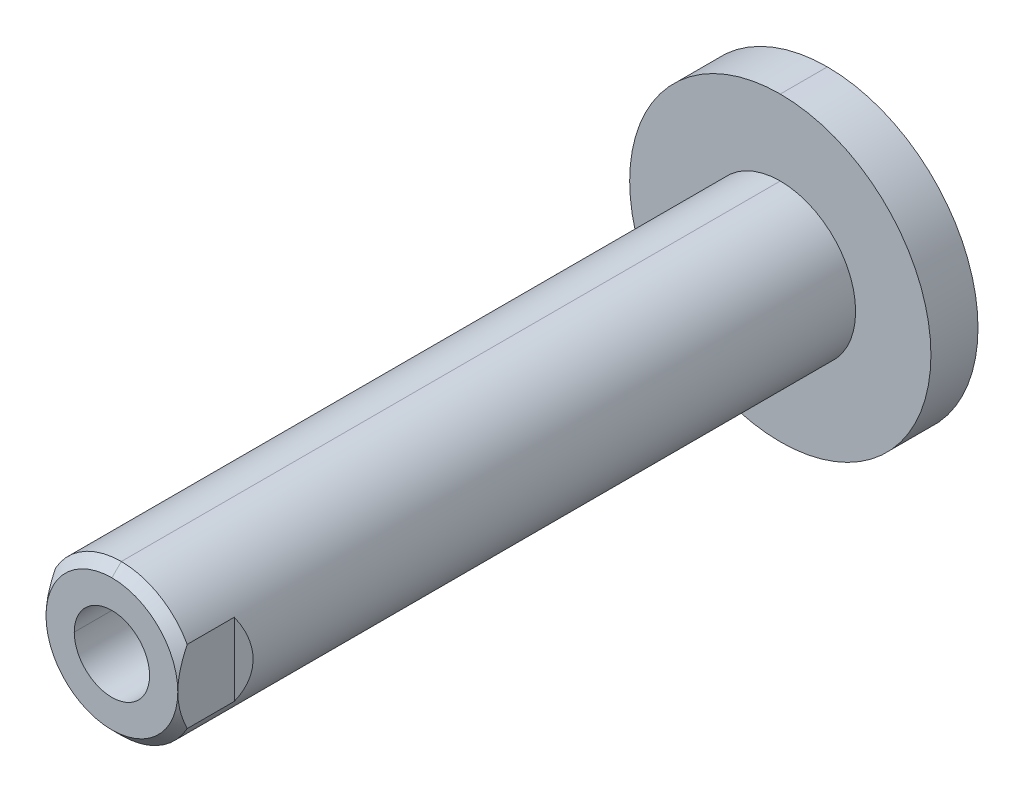
ISO-10303-21;
HEADER;
FILE_DESCRIPTION(('STEP AP214'),'2;1');
FILE_NAME('part.step','',(''),(''),'','','');
FILE_SCHEMA(('AUTOMOTIVE_DESIGN { 1 0 10303 214 1 1 1 1 }'));
ENDSEC;
DATA;
#1=APPLICATION_CONTEXT('core data for automotive mechanical design processes');
#2=APPLICATION_PROTOCOL_DEFINITION('international standard','automotive_design',2000,#1);
#3=PRODUCT_CONTEXT('',#1,'mechanical');
#4=PRODUCT('Part','Part','',(#3));
#5=PRODUCT_RELATED_PRODUCT_CATEGORY('part','',(#4));
#6=PRODUCT_DEFINITION_FORMATION('','',#4);
#7=PRODUCT_DEFINITION_CONTEXT('part definition',#1,'design');
#8=PRODUCT_DEFINITION('design','',#6,#7);
#9=PRODUCT_DEFINITION_SHAPE('','',#8);
#10=(LENGTH_UNIT() NAMED_UNIT(*) SI_UNIT(.MILLI.,.METRE.));
#11=(NAMED_UNIT(*) PLANE_ANGLE_UNIT() SI_UNIT($,.RADIAN.));
#12=(NAMED_UNIT(*) SI_UNIT($,.STERADIAN.) SOLID_ANGLE_UNIT());
#13=UNCERTAINTY_MEASURE_WITH_UNIT(LENGTH_MEASURE(1.E-05),#10,'distance_accuracy_value','');
#14=(GEOMETRIC_REPRESENTATION_CONTEXT(3) GLOBAL_UNCERTAINTY_ASSIGNED_CONTEXT((#13)) GLOBAL_UNIT_ASSIGNED_CONTEXT((#10,
#11,#12)) REPRESENTATION_CONTEXT('',''));
#15=CARTESIAN_POINT('',(0.,0.,0.));
#16=DIRECTION('',(0.,0.,1.));
#17=DIRECTION('',(1.,0.,0.));
#18=AXIS2_PLACEMENT_3D('',#15,#16,#17);
#19=CARTESIAN_POINT('',(0.,0.,48.5));
#20=DIRECTION('',(0.,0.,-1.));
#21=DIRECTION('',(0.,1.,0.));
#22=AXIS2_PLACEMENT_3D('',#19,#20,#21);
#23=CONICAL_SURFACE('',#22,7.,0.785398163397442);
#24=CARTESIAN_POINT('',(0.,0.,48.5));
#25=DIRECTION('',(0.,0.,1.));
#26=DIRECTION('',(0.,1.,0.));
#27=AXIS2_PLACEMENT_3D('',#24,#25,#26);
#28=CIRCLE('',#27,7.);
#29=CARTESIAN_POINT('',(0.,7.,48.5));
#30=VERTEX_POINT('',#29);
#31=CARTESIAN_POINT('',(-7.,0.,48.5));
#32=VERTEX_POINT('',#31);
#33=EDGE_CURVE('E42',#30,#32,#28,.T.);
#34=ORIENTED_EDGE('',*,*,#33,.F.);
#35=DIRECTION('',(0.,0.707106781186543,-0.707106781186552));
#36=VECTOR('',#35,1.);
#37=CARTESIAN_POINT('',(0.,7.,48.5));
#38=LINE('',#37,#36);
#39=CARTESIAN_POINT('',(0.,8.,47.5));
#40=VERTEX_POINT('',#39);
#41=EDGE_CURVE('E11',#30,#40,#38,.T.);
#42=ORIENTED_EDGE('',*,*,#41,.T.);
#43=CARTESIAN_POINT('',(0.,0.,47.5));
#44=DIRECTION('',(0.,0.,-1.));
#45=DIRECTION('',(0.,1.,0.));
#46=AXIS2_PLACEMENT_3D('',#43,#44,#45);
#47=CIRCLE('',#46,8.);
#48=CARTESIAN_POINT('',(-7.,3.87298334620746,47.5));
#49=VERTEX_POINT('',#48);
#50=EDGE_CURVE('E231',#49,#40,#47,.T.);
#51=ORIENTED_EDGE('',*,*,#50,.F.);
#52=CARTESIAN_POINT('',(-7.,0.,48.5));
#53=CARTESIAN_POINT('',(-7.,0.9736613095143,48.5));
#54=CARTESIAN_POINT('',(-7.,1.98627172463951,48.2236495848466));
#55=CARTESIAN_POINT('',(-7.,2.88465323921036,47.9784732556193));
#56=CARTESIAN_POINT('',(-7.,3.87298334620746,47.5));
#57=B_SPLINE_CURVE_WITH_KNOTS('',2,(#52,#53,#54,#55,#56),.UNSPECIFIED.,.F.,.F.,(3,2,3),(0.,0.5,
1.),.UNSPECIFIED.);
#58=EDGE_CURVE('E226',#32,#49,#57,.T.);
#59=ORIENTED_EDGE('',*,*,#58,.F.);
#60=EDGE_LOOP('',(#34,#42,#51,#59));
#61=FACE_BOUND('',#60,.T.);
#62=ADVANCED_FACE('F16',(#61),#23,.T.);
#63=CARTESIAN_POINT('',(0.,0.,48.5));
#64=DIRECTION('',(0.,0.,1.));
#65=DIRECTION('',(1.,0.,0.));
#66=AXIS2_PLACEMENT_3D('',#63,#64,#65);
#67=CYLINDRICAL_SURFACE('',#66,4.);
#68=CARTESIAN_POINT('',(0.,0.,35.5));
#69=DIRECTION('',(0.,0.,1.));
#70=DIRECTION('',(1.,0.,0.));
#71=AXIS2_PLACEMENT_3D('',#68,#69,#70);
#72=CIRCLE('',#71,4.);
#73=CARTESIAN_POINT('',(-4.,0.,35.5));
#74=VERTEX_POINT('',#73);
#75=CARTESIAN_POINT('',(4.,0.,35.5));
#76=VERTEX_POINT('',#75);
#77=EDGE_CURVE('E74',#74,#76,#72,.T.);
#78=ORIENTED_EDGE('',*,*,#77,.F.);
#79=DIRECTION('',(0.,0.,1.));
#80=VECTOR('',#79,1.);
#81=CARTESIAN_POINT('',(-4.,0.,48.5));
#82=LINE('',#81,#80);
#83=CARTESIAN_POINT('',(-4.,0.,48.5));
#84=VERTEX_POINT('',#83);
#85=EDGE_CURVE('E28',#74,#84,#82,.T.);
#86=ORIENTED_EDGE('',*,*,#85,.T.);
#87=CARTESIAN_POINT('',(0.,0.,48.5));
#88=DIRECTION('',(0.,0.,1.));
#89=DIRECTION('',(1.,0.,0.));
#90=AXIS2_PLACEMENT_3D('',#87,#88,#89);
#91=CIRCLE('',#90,4.);
#92=CARTESIAN_POINT('',(4.,0.,48.5));
#93=VERTEX_POINT('',#92);
#94=EDGE_CURVE('E88',#84,#93,#91,.T.);
#95=ORIENTED_EDGE('',*,*,#94,.T.);
#96=DIRECTION('',(0.,0.,1.));
#97=VECTOR('',#96,1.);
#98=CARTESIAN_POINT('',(4.,0.,48.5));
#99=LINE('',#98,#97);
#100=EDGE_CURVE('E178',#76,#93,#99,.T.);
#101=ORIENTED_EDGE('',*,*,#100,.F.);
#102=EDGE_LOOP('',(#78,#86,#95,#101));
#103=FACE_BOUND('',#102,.T.);
#104=ADVANCED_FACE('F241',(#103),#67,.F.);
#105=CARTESIAN_POINT('',(0.,0.,48.5));
#106=DIRECTION('',(0.,0.,1.));
#107=DIRECTION('',(1.,0.,0.));
#108=AXIS2_PLACEMENT_3D('',#105,#106,#107);
#109=CYLINDRICAL_SURFACE('',#108,3.4);
#110=CARTESIAN_POINT('',(0.,0.,31.75));
#111=DIRECTION('',(0.,0.,1.));
#112=DIRECTION('',(1.,0.,0.));
#113=AXIS2_PLACEMENT_3D('',#110,#111,#112);
#114=CIRCLE('',#113,3.4);
#115=CARTESIAN_POINT('',(-3.4,0.,31.75));
#116=VERTEX_POINT('',#115);
#117=CARTESIAN_POINT('',(3.4,0.,31.75));
#118=VERTEX_POINT('',#117);
#119=EDGE_CURVE('E176',#116,#118,#114,.T.);
#120=ORIENTED_EDGE('',*,*,#119,.F.);
#121=DIRECTION('',(0.,0.,1.));
#122=VECTOR('',#121,1.);
#123=CARTESIAN_POINT('',(-3.4,0.,48.5));
#124=LINE('',#123,#122);
#125=CARTESIAN_POINT('',(-3.4,0.,35.5));
#126=VERTEX_POINT('',#125);
#127=EDGE_CURVE('E307',#116,#126,#124,.T.);
#128=ORIENTED_EDGE('',*,*,#127,.T.);
#129=CARTESIAN_POINT('',(0.,0.,35.5));
#130=DIRECTION('',(0.,0.,1.));
#131=DIRECTION('',(1.,0.,0.));
#132=AXIS2_PLACEMENT_3D('',#129,#130,#131);
#133=CIRCLE('',#132,3.4);
#134=CARTESIAN_POINT('',(3.4,0.,35.5));
#135=VERTEX_POINT('',#134);
#136=EDGE_CURVE('E314',#126,#135,#133,.T.);
#137=ORIENTED_EDGE('',*,*,#136,.T.);
#138=DIRECTION('',(0.,0.,1.));
#139=VECTOR('',#138,1.);
#140=CARTESIAN_POINT('',(3.4,0.,48.5));
#141=LINE('',#140,#139);
#142=EDGE_CURVE('E327',#118,#135,#141,.T.);
#143=ORIENTED_EDGE('',*,*,#142,.F.);
#144=EDGE_LOOP('',(#120,#128,#137,#143));
#145=FACE_BOUND('',#144,.T.);
#146=ADVANCED_FACE('F405',(#145),#109,.F.);
#147=CARTESIAN_POINT('',(0.,0.,31.75));
#148=DIRECTION('',(0.,0.,1.));
#149=DIRECTION('',(1.,0.,0.));
#150=AXIS2_PLACEMENT_3D('',#147,#148,#149);
#151=CONICAL_SURFACE('',#150,3.4,1.02974425867665);
#152=DIRECTION('',(0.857167300702111,0.,0.515038074910056));
#153=VECTOR('',#152,1.);
#154=CARTESIAN_POINT('',(3.4,0.,31.75));
#155=LINE('',#154,#153);
#156=CARTESIAN_POINT('',(0.,0.,29.7070738953063));
#157=VERTEX_POINT('',#156);
#158=EDGE_CURVE('E340',#157,#118,#155,.T.);
#159=ORIENTED_EDGE('',*,*,#158,.F.);
#160=DIRECTION('',(-0.857167300702111,0.,0.515038074910056));
#161=VECTOR('',#160,1.);
#162=CARTESIAN_POINT('',(-3.4,0.,31.75));
#163=LINE('',#162,#161);
#164=EDGE_CURVE('E324',#157,#116,#163,.T.);
#165=ORIENTED_EDGE('',*,*,#164,.T.);
#166=ORIENTED_EDGE('',*,*,#119,.T.);
#167=EDGE_LOOP('',(#159,#165,#166));
#168=FACE_BOUND('',#167,.T.);
#169=ADVANCED_FACE('F400',(#168),#151,.F.);
#170=CARTESIAN_POINT('',(0.,0.,-27.5));
#171=DIRECTION('',(0.,0.,1.));
#172=DIRECTION('',(0.,-1.,0.));
#173=AXIS2_PLACEMENT_3D('',#170,#171,#172);
#174=CYLINDRICAL_SURFACE('',#173,16.);
#175=CARTESIAN_POINT('',(0.,0.,-27.5));
#176=DIRECTION('',(0.,0.,1.));
#177=DIRECTION('',(0.,-1.,0.));
#178=AXIS2_PLACEMENT_3D('',#175,#176,#177);
#179=CIRCLE('',#178,16.);
#180=CARTESIAN_POINT('',(0.,-16.,-27.5));
#181=VERTEX_POINT('',#180);
#182=CARTESIAN_POINT('',(0.,16.,-27.5));
#183=VERTEX_POINT('',#182);
#184=EDGE_CURVE('E315',#181,#183,#179,.T.);
#185=ORIENTED_EDGE('',*,*,#184,.T.);
#186=DIRECTION('',(0.,0.,1.));
#187=VECTOR('',#186,1.);
#188=CARTESIAN_POINT('',(0.,16.,-27.5));
#189=LINE('',#188,#187);
#190=CARTESIAN_POINT('',(0.,16.,-22.5));
#191=VERTEX_POINT('',#190);
#192=EDGE_CURVE('E161',#183,#191,#189,.T.);
#193=ORIENTED_EDGE('',*,*,#192,.T.);
#194=CARTESIAN_POINT('',(0.,0.,-22.5));
#195=DIRECTION('',(0.,0.,1.));
#196=DIRECTION('',(0.,-1.,0.));
#197=AXIS2_PLACEMENT_3D('',#194,#195,#196);
#198=CIRCLE('',#197,16.);
#199=CARTESIAN_POINT('',(0.,-16.,-22.5));
#200=VERTEX_POINT('',#199);
#201=EDGE_CURVE('E185',#200,#191,#198,.T.);
#202=ORIENTED_EDGE('',*,*,#201,.F.);
#203=DIRECTION('',(0.,0.,1.));
#204=VECTOR('',#203,1.);
#205=CARTESIAN_POINT('',(0.,-16.,-27.5));
#206=LINE('',#205,#204);
#207=EDGE_CURVE('E356',#181,#200,#206,.T.);
#208=ORIENTED_EDGE('',*,*,#207,.F.);
#209=EDGE_LOOP('',(#185,#193,#202,#208));
#210=FACE_BOUND('',#209,.T.);
#211=ADVANCED_FACE('F500',(#210),#174,.T.);
#212=CARTESIAN_POINT('',(0.,0.,-27.5));
#213=DIRECTION('',(0.,0.,1.));
#214=DIRECTION('',(0.,-1.,0.));
#215=AXIS2_PLACEMENT_3D('',#212,#213,#214);
#216=CYLINDRICAL_SURFACE('',#215,8.);
#217=CARTESIAN_POINT('',(0.,0.,-22.5));
#218=DIRECTION('',(0.,0.,1.));
#219=DIRECTION('',(0.,-1.,0.));
#220=AXIS2_PLACEMENT_3D('',#217,#218,#219);
#221=CIRCLE('',#220,8.);
#222=CARTESIAN_POINT('',(0.,-8.,-22.5));
#223=VERTEX_POINT('',#222);
#224=CARTESIAN_POINT('',(0.,8.,-22.5));
#225=VERTEX_POINT('',#224);
#226=EDGE_CURVE('E146',#223,#225,#221,.T.);
#227=ORIENTED_EDGE('',*,*,#226,.T.);
#228=DIRECTION('',(0.,0.,1.));
#229=VECTOR('',#228,1.);
#230=CARTESIAN_POINT('',(0.,8.,-27.5));
#231=LINE('',#230,#229);
#232=EDGE_CURVE('E162',#225,#40,#231,.T.);
#233=ORIENTED_EDGE('',*,*,#232,.T.);
#234=CARTESIAN_POINT('',(0.,0.,47.5));
#235=DIRECTION('',(0.,0.,-1.));
#236=DIRECTION('',(0.,1.,0.));
#237=AXIS2_PLACEMENT_3D('',#234,#235,#236);
#238=CIRCLE('',#237,8.);
#239=CARTESIAN_POINT('',(7.,3.87298334620746,47.5));
#240=VERTEX_POINT('',#239);
#241=EDGE_CURVE('E292',#40,#240,#238,.T.);
#242=ORIENTED_EDGE('',*,*,#241,.T.);
#243=DIRECTION('',(0.,0.,1.));
#244=VECTOR('',#243,1.);
#245=CARTESIAN_POINT('',(7.,3.87298334620746,42.5));
#246=LINE('',#245,#244);
#247=CARTESIAN_POINT('',(7.,3.87298334620746,42.5));
#248=VERTEX_POINT('',#247);
#249=EDGE_CURVE('E380',#248,#240,#246,.T.);
#250=ORIENTED_EDGE('',*,*,#249,.F.);
#251=CARTESIAN_POINT('',(7.,3.87298334620746,42.5));
#252=CARTESIAN_POINT('',(8.36363636363637,1.40835758043908,41.1363636363636));
#253=CARTESIAN_POINT('',(8.36363636363636,-1.40835758043907,41.1363636363636));
#254=CARTESIAN_POINT('',(7.,-3.87298334620745,42.5));
#255=(BOUNDED_CURVE() B_SPLINE_CURVE(3,(#251,#252,#253,#254),.UNSPECIFIED.,.F.,
.F.) B_SPLINE_CURVE_WITH_KNOTS((4,4),(2.63623214330563,3.64695316387395),
.UNSPECIFIED.) CURVE() GEOMETRIC_REPRESENTATION_ITEM() RATIONAL_B_SPLINE_CURVE((1.,
0.916666666666665,0.916666666666665,1.)) REPRESENTATION_ITEM(''));
#256=CARTESIAN_POINT('',(7.,-3.87298334620745,42.5));
#257=VERTEX_POINT('',#256);
#258=EDGE_CURVE('E284',#248,#257,#255,.T.);
#259=ORIENTED_EDGE('',*,*,#258,.T.);
#260=DIRECTION('',(0.,0.,1.));
#261=VECTOR('',#260,1.);
#262=CARTESIAN_POINT('',(7.,-3.87298334620745,42.5));
#263=LINE('',#262,#261);
#264=CARTESIAN_POINT('',(7.,-3.87298334620745,47.5));
#265=VERTEX_POINT('',#264);
#266=EDGE_CURVE('E280',#257,#265,#263,.T.);
#267=ORIENTED_EDGE('',*,*,#266,.T.);
#268=CARTESIAN_POINT('',(0.,0.,47.5));
#269=DIRECTION('',(0.,0.,-1.));
#270=DIRECTION('',(0.,1.,0.));
#271=AXIS2_PLACEMENT_3D('',#268,#269,#270);
#272=CIRCLE('',#271,8.);
#273=CARTESIAN_POINT('',(0.,-8.,47.5));
#274=VERTEX_POINT('',#273);
#275=EDGE_CURVE('E149',#265,#274,#272,.T.);
#276=ORIENTED_EDGE('',*,*,#275,.T.);
#277=DIRECTION('',(0.,0.,1.));
#278=VECTOR('',#277,1.);
#279=CARTESIAN_POINT('',(0.,-8.,-27.5));
#280=LINE('',#279,#278);
#281=EDGE_CURVE('E142',#223,#274,#280,.T.);
#282=ORIENTED_EDGE('',*,*,#281,.F.);
#283=EDGE_LOOP('',(#227,#233,#242,#250,#259,#267,#276,#282));
#284=FACE_BOUND('',#283,.T.);
#285=ADVANCED_FACE('F144',(#284),#216,.T.);
#286=CARTESIAN_POINT('',(0.,0.,48.5));
#287=DIRECTION('',(0.,0.,-1.));
#288=DIRECTION('',(0.,-1.,0.));
#289=AXIS2_PLACEMENT_3D('',#286,#287,#288);
#290=PLANE('',#289);
#291=CARTESIAN_POINT('',(0.,0.,48.5));
#292=DIRECTION('',(0.,0.,1.));
#293=DIRECTION('',(0.,1.,0.));
#294=AXIS2_PLACEMENT_3D('',#291,#292,#293);
#295=CIRCLE('',#294,7.);
#296=CARTESIAN_POINT('',(7.,0.,48.5));
#297=VERTEX_POINT('',#296);
#298=EDGE_CURVE('E281',#297,#30,#295,.T.);
#299=ORIENTED_EDGE('',*,*,#298,.T.);
#300=ORIENTED_EDGE('',*,*,#33,.T.);
#301=CARTESIAN_POINT('',(0.,0.,48.5));
#302=DIRECTION('',(0.,0.,1.));
#303=DIRECTION('',(0.,1.,0.));
#304=AXIS2_PLACEMENT_3D('',#301,#302,#303);
#305=CIRCLE('',#304,7.);
#306=EDGE_CURVE('E166',#32,#297,#305,.T.);
#307=ORIENTED_EDGE('',*,*,#306,.T.);
#308=EDGE_LOOP('',(#299,#300,#307));
#309=FACE_BOUND('',#308,.T.);
#310=CARTESIAN_POINT('',(0.,0.,48.5));
#311=DIRECTION('',(0.,0.,1.));
#312=DIRECTION('',(1.,0.,0.));
#313=AXIS2_PLACEMENT_3D('',#310,#311,#312);
#314=CIRCLE('',#313,4.);
#315=EDGE_CURVE('E181',#93,#84,#314,.T.);
#316=ORIENTED_EDGE('',*,*,#315,.F.);
#317=ORIENTED_EDGE('',*,*,#94,.F.);
#318=EDGE_LOOP('',(#316,#317));
#319=FACE_BOUND('',#318,.T.);
#320=ADVANCED_FACE('F244',(#309,#319),#290,.F.);
#321=CARTESIAN_POINT('',(0.,0.,-27.5));
#322=DIRECTION('',(0.,0.,1.));
#323=DIRECTION('',(0.,-1.,0.));
#324=AXIS2_PLACEMENT_3D('',#321,#322,#323);
#325=CYLINDRICAL_SURFACE('',#324,8.);
#326=ORIENTED_EDGE('',*,*,#232,.F.);
#327=CARTESIAN_POINT('',(0.,0.,-22.5));
#328=DIRECTION('',(0.,0.,1.));
#329=DIRECTION('',(0.,-1.,0.));
#330=AXIS2_PLACEMENT_3D('',#327,#328,#329);
#331=CIRCLE('',#330,8.);
#332=EDGE_CURVE('E155',#225,#223,#331,.T.);
#333=ORIENTED_EDGE('',*,*,#332,.T.);
#334=ORIENTED_EDGE('',*,*,#281,.T.);
#335=CARTESIAN_POINT('',(0.,0.,47.5));
#336=DIRECTION('',(0.,0.,-1.));
#337=DIRECTION('',(0.,1.,0.));
#338=AXIS2_PLACEMENT_3D('',#335,#336,#337);
#339=CIRCLE('',#338,8.);
#340=CARTESIAN_POINT('',(-7.,-3.87298334620745,47.5));
#341=VERTEX_POINT('',#340);
#342=EDGE_CURVE('E156',#274,#341,#339,.T.);
#343=ORIENTED_EDGE('',*,*,#342,.T.);
#344=DIRECTION('',(0.,0.,1.));
#345=VECTOR('',#344,1.);
#346=CARTESIAN_POINT('',(-7.,-3.87298334620745,42.5));
#347=LINE('',#346,#345);
#348=CARTESIAN_POINT('',(-7.,-3.87298334620745,42.5));
#349=VERTEX_POINT('',#348);
#350=EDGE_CURVE('E758',#349,#341,#347,.T.);
#351=ORIENTED_EDGE('',*,*,#350,.F.);
#352=CARTESIAN_POINT('',(-7.,-3.87298334620745,42.5));
#353=CARTESIAN_POINT('',(-8.36363636363636,-1.40835758043907,41.1363636363636));
#354=CARTESIAN_POINT('',(-8.36363636363636,1.40835758043908,41.1363636363636));
#355=CARTESIAN_POINT('',(-7.,3.87298334620746,42.5));
#356=(BOUNDED_CURVE() B_SPLINE_CURVE(3,(#352,#353,#354,#355),.UNSPECIFIED.,.F.,
.F.) B_SPLINE_CURVE_WITH_KNOTS((4,4),(2.63623214330563,3.64695316387395),
.UNSPECIFIED.) CURVE() GEOMETRIC_REPRESENTATION_ITEM() RATIONAL_B_SPLINE_CURVE((1.,
0.916666666666665,0.916666666666665,1.)) REPRESENTATION_ITEM(''));
#357=CARTESIAN_POINT('',(-7.,3.87298334620746,42.5));
#358=VERTEX_POINT('',#357);
#359=EDGE_CURVE('E366',#349,#358,#356,.T.);
#360=ORIENTED_EDGE('',*,*,#359,.T.);
#361=DIRECTION('',(0.,0.,1.));
#362=VECTOR('',#361,1.);
#363=CARTESIAN_POINT('',(-7.,3.87298334620746,42.5));
#364=LINE('',#363,#362);
#365=EDGE_CURVE('E372',#358,#49,#364,.T.);
#366=ORIENTED_EDGE('',*,*,#365,.T.);
#367=ORIENTED_EDGE('',*,*,#50,.T.);
#368=EDGE_LOOP('',(#326,#333,#334,#343,#351,#360,#366,#367));
#369=FACE_BOUND('',#368,.T.);
#370=ADVANCED_FACE('F164',(#369),#325,.T.);
#371=CARTESIAN_POINT('',(0.,8.,-22.5));
#372=DIRECTION('',(0.,0.,-1.));
#373=DIRECTION('',(0.,-1.,0.));
#374=AXIS2_PLACEMENT_3D('',#371,#372,#373);
#375=PLANE('',#374);
#376=ORIENTED_EDGE('',*,*,#201,.T.);
#377=CARTESIAN_POINT('',(0.,0.,-22.5));
#378=DIRECTION('',(0.,0.,1.));
#379=DIRECTION('',(0.,-1.,0.));
#380=AXIS2_PLACEMENT_3D('',#377,#378,#379);
#381=CIRCLE('',#380,16.);
#382=EDGE_CURVE('E182',#191,#200,#381,.T.);
#383=ORIENTED_EDGE('',*,*,#382,.T.);
#384=EDGE_LOOP('',(#376,#383));
#385=FACE_BOUND('',#384,.T.);
#386=ORIENTED_EDGE('',*,*,#226,.F.);
#387=ORIENTED_EDGE('',*,*,#332,.F.);
#388=EDGE_LOOP('',(#386,#387));
#389=FACE_BOUND('',#388,.T.);
#390=ADVANCED_FACE('F159',(#385,#389),#375,.F.);
#391=CARTESIAN_POINT('',(0.,0.,-27.5));
#392=DIRECTION('',(0.,0.,1.));
#393=DIRECTION('',(0.,-1.,0.));
#394=AXIS2_PLACEMENT_3D('',#391,#392,#393);
#395=CYLINDRICAL_SURFACE('',#394,16.);
#396=ORIENTED_EDGE('',*,*,#192,.F.);
#397=CARTESIAN_POINT('',(0.,0.,-27.5));
#398=DIRECTION('',(0.,0.,1.));
#399=DIRECTION('',(0.,-1.,0.));
#400=AXIS2_PLACEMENT_3D('',#397,#398,#399);
#401=CIRCLE('',#400,16.);
#402=EDGE_CURVE('E186',#183,#181,#401,.T.);
#403=ORIENTED_EDGE('',*,*,#402,.T.);
#404=ORIENTED_EDGE('',*,*,#207,.T.);
#405=ORIENTED_EDGE('',*,*,#382,.F.);
#406=EDGE_LOOP('',(#396,#403,#404,#405));
#407=FACE_BOUND('',#406,.T.);
#408=ADVANCED_FACE('F517',(#407),#395,.T.);
#409=CARTESIAN_POINT('',(0.,16.,-27.5));
#410=DIRECTION('',(0.,0.,1.));
#411=DIRECTION('',(1.,0.,0.));
#412=AXIS2_PLACEMENT_3D('',#409,#410,#411);
#413=PLANE('',#412);
#414=ORIENTED_EDGE('',*,*,#184,.F.);
#415=ORIENTED_EDGE('',*,*,#402,.F.);
#416=EDGE_LOOP('',(#414,#415));
#417=FACE_BOUND('',#416,.T.);
#418=ADVANCED_FACE('F208',(#417),#413,.F.);
#419=CARTESIAN_POINT('',(-7.,3.87298334620746,42.5));
#420=DIRECTION('',(1.,0.,0.));
#421=DIRECTION('',(0.,1.,0.));
#422=AXIS2_PLACEMENT_3D('',#419,#420,#421);
#423=PLANE('',#422);
#424=ORIENTED_EDGE('',*,*,#350,.T.);
#425=CARTESIAN_POINT('',(-7.,-3.87298334620744,47.5));
#426=CARTESIAN_POINT('',(-7.,-2.89169319005255,47.9750650540731));
#427=CARTESIAN_POINT('',(-7.,-1.99823632380534,48.2203744323094));
#428=CARTESIAN_POINT('',(-7.,-0.979794284500745,48.5));
#429=CARTESIAN_POINT('',(-7.,0.,48.5));
#430=B_SPLINE_CURVE_WITH_KNOTS('',2,(#425,#426,#427,#428,#429),.UNSPECIFIED.,.F.,.F.,(3,2,3),
(0.,0.5,1.),.UNSPECIFIED.);
#431=EDGE_CURVE('E192',#341,#32,#430,.T.);
#432=ORIENTED_EDGE('',*,*,#431,.T.);
#433=ORIENTED_EDGE('',*,*,#58,.T.);
#434=ORIENTED_EDGE('',*,*,#365,.F.);
#435=DIRECTION('',(0.,1.,0.));
#436=VECTOR('',#435,1.);
#437=CARTESIAN_POINT('',(-7.,3.87298334620746,42.5));
#438=LINE('',#437,#436);
#439=EDGE_CURVE('E373',#349,#358,#438,.T.);
#440=ORIENTED_EDGE('',*,*,#439,.F.);
#441=EDGE_LOOP('',(#424,#432,#433,#434,#440));
#442=FACE_BOUND('',#441,.T.);
#443=ADVANCED_FACE('F198',(#442),#423,.F.);
#444=CARTESIAN_POINT('',(7.,3.87298334620746,42.5));
#445=DIRECTION('',(-1.,0.,0.));
#446=DIRECTION('',(0.,0.,1.));
#447=AXIS2_PLACEMENT_3D('',#444,#445,#446);
#448=PLANE('',#447);
#449=CARTESIAN_POINT('',(7.,3.87298334620746,47.5));
#450=CARTESIAN_POINT('',(7.,2.8916931900237,47.9750650540872));
#451=CARTESIAN_POINT('',(7.,1.99823632380535,48.2203744323094));
#452=CARTESIAN_POINT('',(7.,0.97979428447546,48.5));
#453=CARTESIAN_POINT('',(7.,0.,48.5));
#454=B_SPLINE_CURVE_WITH_KNOTS('',2,(#449,#450,#451,#452,#453),.UNSPECIFIED.,.F.,.F.,(3,2,3),
(0.,0.5,1.),.UNSPECIFIED.);
#455=EDGE_CURVE('E133',#240,#297,#454,.T.);
#456=ORIENTED_EDGE('',*,*,#455,.T.);
#457=CARTESIAN_POINT('',(7.,0.,48.5));
#458=CARTESIAN_POINT('',(7.,-0.973661309489665,48.5));
#459=CARTESIAN_POINT('',(7.,-1.9862717246395,48.2236495848466));
#460=CARTESIAN_POINT('',(7.,-2.88465323918247,47.9784732556329));
#461=CARTESIAN_POINT('',(7.,-3.87298334620744,47.5));
#462=B_SPLINE_CURVE_WITH_KNOTS('',2,(#457,#458,#459,#460,#461),.UNSPECIFIED.,.F.,.F.,(3,2,3),
(0.,0.5,1.),.UNSPECIFIED.);
#463=EDGE_CURVE('E433',#297,#265,#462,.T.);
#464=ORIENTED_EDGE('',*,*,#463,.T.);
#465=ORIENTED_EDGE('',*,*,#266,.F.);
#466=DIRECTION('',(0.,-1.,0.));
#467=VECTOR('',#466,1.);
#468=CARTESIAN_POINT('',(7.,3.87298334620746,42.5));
#469=LINE('',#468,#467);
#470=EDGE_CURVE('E381',#248,#257,#469,.T.);
#471=ORIENTED_EDGE('',*,*,#470,.F.);
#472=ORIENTED_EDGE('',*,*,#249,.T.);
#473=EDGE_LOOP('',(#456,#464,#465,#471,#472));
#474=FACE_BOUND('',#473,.T.);
#475=ADVANCED_FACE('F18',(#474),#448,.F.);
#476=CARTESIAN_POINT('',(-8.,-16.,41.5));
#477=DIRECTION('',(0.70710678118655,0.,-0.707106781186545));
#478=DIRECTION('',(0.,-1.,0.));
#479=AXIS2_PLACEMENT_3D('',#476,#477,#478);
#480=PLANE('',#479);
#481=ORIENTED_EDGE('',*,*,#439,.T.);
#482=ORIENTED_EDGE('',*,*,#359,.F.);
#483=EDGE_LOOP('',(#481,#482));
#484=FACE_BOUND('',#483,.T.);
#485=ADVANCED_FACE('F560',(#484),#480,.F.);
#486=CARTESIAN_POINT('',(8.,-16.,41.5));
#487=DIRECTION('',(-0.70710678118655,0.,-0.707106781186545));
#488=DIRECTION('',(-0.707106781186545,0.,0.70710678118655));
#489=AXIS2_PLACEMENT_3D('',#486,#487,#488);
#490=PLANE('',#489);
#491=ORIENTED_EDGE('',*,*,#470,.T.);
#492=ORIENTED_EDGE('',*,*,#258,.F.);
#493=EDGE_LOOP('',(#491,#492));
#494=FACE_BOUND('',#493,.T.);
#495=ADVANCED_FACE('F210',(#494),#490,.F.);
#496=CARTESIAN_POINT('',(0.,0.,31.75));
#497=DIRECTION('',(0.,0.,1.));
#498=DIRECTION('',(1.,0.,0.));
#499=AXIS2_PLACEMENT_3D('',#496,#497,#498);
#500=CONICAL_SURFACE('',#499,3.4,1.02974425867665);
#501=ORIENTED_EDGE('',*,*,#164,.F.);
#502=ORIENTED_EDGE('',*,*,#158,.T.);
#503=CARTESIAN_POINT('',(0.,0.,31.75));
#504=DIRECTION('',(0.,0.,1.));
#505=DIRECTION('',(1.,0.,0.));
#506=AXIS2_PLACEMENT_3D('',#503,#504,#505);
#507=CIRCLE('',#506,3.4);
#508=EDGE_CURVE('E330',#118,#116,#507,.T.);
#509=ORIENTED_EDGE('',*,*,#508,.T.);
#510=EDGE_LOOP('',(#501,#502,#509));
#511=FACE_BOUND('',#510,.T.);
#512=ADVANCED_FACE('F253',(#511),#500,.F.);
#513=CARTESIAN_POINT('',(0.,0.,48.5));
#514=DIRECTION('',(0.,0.,1.));
#515=DIRECTION('',(1.,0.,0.));
#516=AXIS2_PLACEMENT_3D('',#513,#514,#515);
#517=CYLINDRICAL_SURFACE('',#516,3.4);
#518=ORIENTED_EDGE('',*,*,#127,.F.);
#519=ORIENTED_EDGE('',*,*,#508,.F.);
#520=ORIENTED_EDGE('',*,*,#142,.T.);
#521=CARTESIAN_POINT('',(0.,0.,35.5));
#522=DIRECTION('',(0.,0.,1.));
#523=DIRECTION('',(1.,0.,0.));
#524=AXIS2_PLACEMENT_3D('',#521,#522,#523);
#525=CIRCLE('',#524,3.4);
#526=EDGE_CURVE('E331',#135,#126,#525,.T.);
#527=ORIENTED_EDGE('',*,*,#526,.T.);
#528=EDGE_LOOP('',(#518,#519,#520,#527));
#529=FACE_BOUND('',#528,.T.);
#530=ADVANCED_FACE('F249',(#529),#517,.F.);
#531=CARTESIAN_POINT('',(3.4,0.,35.5));
#532=DIRECTION('',(0.,0.,-1.));
#533=DIRECTION('',(0.,-1.,0.));
#534=AXIS2_PLACEMENT_3D('',#531,#532,#533);
#535=PLANE('',#534);
#536=CARTESIAN_POINT('',(0.,0.,35.5));
#537=DIRECTION('',(0.,0.,1.));
#538=DIRECTION('',(1.,0.,0.));
#539=AXIS2_PLACEMENT_3D('',#536,#537,#538);
#540=CIRCLE('',#539,4.);
#541=EDGE_CURVE('E343',#76,#74,#540,.T.);
#542=ORIENTED_EDGE('',*,*,#541,.T.);
#543=ORIENTED_EDGE('',*,*,#77,.T.);
#544=EDGE_LOOP('',(#542,#543));
#545=FACE_BOUND('',#544,.T.);
#546=ORIENTED_EDGE('',*,*,#526,.F.);
#547=ORIENTED_EDGE('',*,*,#136,.F.);
#548=EDGE_LOOP('',(#546,#547));
#549=FACE_BOUND('',#548,.T.);
#550=ADVANCED_FACE('F245',(#545,#549),#535,.F.);
#551=CARTESIAN_POINT('',(0.,0.,48.5));
#552=DIRECTION('',(0.,0.,1.));
#553=DIRECTION('',(1.,0.,0.));
#554=AXIS2_PLACEMENT_3D('',#551,#552,#553);
#555=CYLINDRICAL_SURFACE('',#554,4.);
#556=ORIENTED_EDGE('',*,*,#85,.F.);
#557=ORIENTED_EDGE('',*,*,#541,.F.);
#558=ORIENTED_EDGE('',*,*,#100,.T.);
#559=ORIENTED_EDGE('',*,*,#315,.T.);
#560=EDGE_LOOP('',(#556,#557,#558,#559));
#561=FACE_BOUND('',#560,.T.);
#562=ADVANCED_FACE('F248',(#561),#555,.F.);
#563=CARTESIAN_POINT('',(0.,0.,48.5));
#564=DIRECTION('',(0.,0.,-1.));
#565=DIRECTION('',(0.,1.,0.));
#566=AXIS2_PLACEMENT_3D('',#563,#564,#565);
#567=CONICAL_SURFACE('',#566,7.,0.785398163397442);
#568=ORIENTED_EDGE('',*,*,#431,.F.);
#569=ORIENTED_EDGE('',*,*,#342,.F.);
#570=ORIENTED_EDGE('',*,*,#275,.F.);
#571=ORIENTED_EDGE('',*,*,#463,.F.);
#572=ORIENTED_EDGE('',*,*,#306,.F.);
#573=EDGE_LOOP('',(#568,#569,#570,#571,#572));
#574=FACE_BOUND('',#573,.T.);
#575=ADVANCED_FACE('F255',(#574),#567,.T.);
#576=CARTESIAN_POINT('',(0.,0.,48.5));
#577=DIRECTION('',(0.,0.,-1.));
#578=DIRECTION('',(0.,1.,0.));
#579=AXIS2_PLACEMENT_3D('',#576,#577,#578);
#580=CONICAL_SURFACE('',#579,7.,0.785398163397442);
#581=ORIENTED_EDGE('',*,*,#41,.F.);
#582=ORIENTED_EDGE('',*,*,#298,.F.);
#583=ORIENTED_EDGE('',*,*,#455,.F.);
#584=ORIENTED_EDGE('',*,*,#241,.F.);
#585=EDGE_LOOP('',(#581,#582,#583,#584));
#586=FACE_BOUND('',#585,.T.);
#587=ADVANCED_FACE('F259',(#586),#580,.T.);
#588=CLOSED_SHELL('',(#62,#104,#146,#169,#211,#285,#320,#370,#390,#408,#418,#443,#475,#485,#495,
#512,#530,#550,#562,#575,#587));
#589=MANIFOLD_SOLID_BREP('B1',#588);
#590=ADVANCED_BREP_SHAPE_REPRESENTATION('',(#18,#589),#14);
#591=SHAPE_DEFINITION_REPRESENTATION(#9,#590);
ENDSEC;
END-ISO-10303-21;
